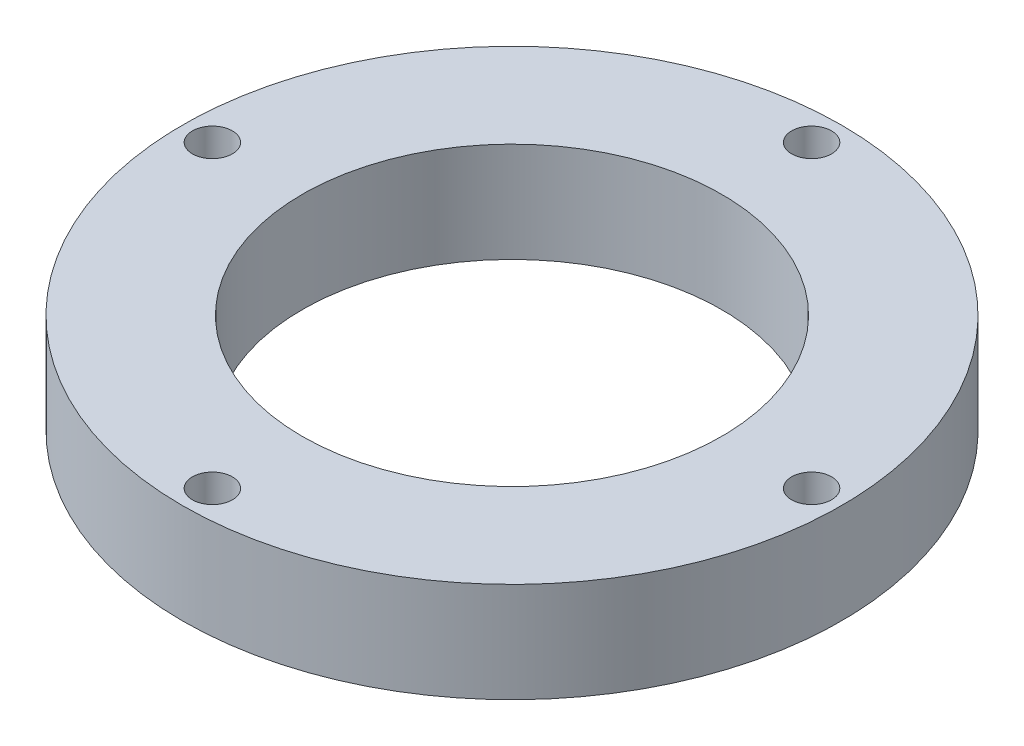
ISO-10303-21;
HEADER;
FILE_DESCRIPTION(('STEP AP214'),'2;1');
FILE_NAME('part.step','',(''),(''),'','','');
FILE_SCHEMA(('AUTOMOTIVE_DESIGN { 1 0 10303 214 1 1 1 1 }'));
ENDSEC;
DATA;
#1=APPLICATION_CONTEXT('core data for automotive mechanical design processes');
#2=APPLICATION_PROTOCOL_DEFINITION('international standard','automotive_design',2000,#1);
#3=PRODUCT_CONTEXT('',#1,'mechanical');
#4=PRODUCT('Part','Part','',(#3));
#5=PRODUCT_RELATED_PRODUCT_CATEGORY('part','',(#4));
#6=PRODUCT_DEFINITION_FORMATION('','',#4);
#7=PRODUCT_DEFINITION_CONTEXT('part definition',#1,'design');
#8=PRODUCT_DEFINITION('design','',#6,#7);
#9=PRODUCT_DEFINITION_SHAPE('','',#8);
#10=(LENGTH_UNIT() NAMED_UNIT(*) SI_UNIT(.MILLI.,.METRE.));
#11=(NAMED_UNIT(*) PLANE_ANGLE_UNIT() SI_UNIT($,.RADIAN.));
#12=(NAMED_UNIT(*) SI_UNIT($,.STERADIAN.) SOLID_ANGLE_UNIT());
#13=UNCERTAINTY_MEASURE_WITH_UNIT(LENGTH_MEASURE(1.E-05),#10,'distance_accuracy_value','');
#14=(GEOMETRIC_REPRESENTATION_CONTEXT(3) GLOBAL_UNCERTAINTY_ASSIGNED_CONTEXT((#13)) GLOBAL_UNIT_ASSIGNED_CONTEXT((#10,
#11,#12)) REPRESENTATION_CONTEXT('',''));
#15=CARTESIAN_POINT('',(0.,0.,0.));
#16=DIRECTION('',(0.,0.,1.));
#17=DIRECTION('',(1.,0.,0.));
#18=AXIS2_PLACEMENT_3D('',#15,#16,#17);
#19=CARTESIAN_POINT('',(0.,12.7,0.));
#20=DIRECTION('',(0.,-1.,0.));
#21=DIRECTION('',(0.,0.,-1.));
#22=AXIS2_PLACEMENT_3D('',#19,#20,#21);
#23=CYLINDRICAL_SURFACE('',#22,41.91);
#24=CARTESIAN_POINT('',(0.,12.7,0.));
#25=DIRECTION('',(0.,1.,0.));
#26=DIRECTION('',(0.,0.,1.));
#27=AXIS2_PLACEMENT_3D('',#24,#25,#26);
#28=CIRCLE('',#27,41.91);
#29=CARTESIAN_POINT('',(0.,12.7,41.91));
#30=VERTEX_POINT('',#29);
#31=EDGE_CURVE('E11',#30,#30,#28,.T.);
#32=ORIENTED_EDGE('',*,*,#31,.F.);
#33=EDGE_LOOP('',(#32));
#34=FACE_BOUND('',#33,.T.);
#35=CARTESIAN_POINT('',(0.,0.,0.));
#36=DIRECTION('',(0.,1.,0.));
#37=DIRECTION('',(0.,0.,1.));
#38=AXIS2_PLACEMENT_3D('',#35,#36,#37);
#39=CIRCLE('',#38,41.91);
#40=CARTESIAN_POINT('',(0.,0.,41.91));
#41=VERTEX_POINT('',#40);
#42=EDGE_CURVE('E44',#41,#41,#39,.T.);
#43=ORIENTED_EDGE('',*,*,#42,.T.);
#44=EDGE_LOOP('',(#43));
#45=FACE_BOUND('',#44,.T.);
#46=ADVANCED_FACE('F41',(#34,#45),#23,.T.);
#47=CARTESIAN_POINT('',(0.,12.7,0.));
#48=DIRECTION('',(0.,1.,0.));
#49=DIRECTION('',(0.,0.,1.));
#50=AXIS2_PLACEMENT_3D('',#47,#48,#49);
#51=PLANE('',#50);
#52=CARTESIAN_POINT('',(38.1,12.7,1.33025439009923E-13));
#53=DIRECTION('',(0.,1.,0.));
#54=DIRECTION('',(-1.,0.,0.));
#55=AXIS2_PLACEMENT_3D('',#52,#53,#54);
#56=CIRCLE('',#55,2.54);
#57=CARTESIAN_POINT('',(38.1,12.7,2.54000000000013));
#58=VERTEX_POINT('',#57);
#59=EDGE_CURVE('E75',#58,#58,#56,.T.);
#60=ORIENTED_EDGE('',*,*,#59,.F.);
#61=EDGE_LOOP('',(#60));
#62=FACE_BOUND('',#61,.T.);
#63=CARTESIAN_POINT('',(0.,12.7,38.1));
#64=DIRECTION('',(0.,1.,0.));
#65=DIRECTION('',(0.,0.,-1.));
#66=AXIS2_PLACEMENT_3D('',#63,#64,#65);
#67=CIRCLE('',#66,2.54);
#68=CARTESIAN_POINT('',(0.,12.7,40.64));
#69=VERTEX_POINT('',#68);
#70=EDGE_CURVE('E68',#69,#69,#67,.T.);
#71=ORIENTED_EDGE('',*,*,#70,.F.);
#72=EDGE_LOOP('',(#71));
#73=FACE_BOUND('',#72,.T.);
#74=CARTESIAN_POINT('',(-38.1,12.7,-3.9907631702977E-13));
#75=DIRECTION('',(0.,1.,0.));
#76=DIRECTION('',(1.,0.,0.));
#77=AXIS2_PLACEMENT_3D('',#74,#75,#76);
#78=CIRCLE('',#77,2.54);
#79=CARTESIAN_POINT('',(-38.1,12.7,2.5399999999996));
#80=VERTEX_POINT('',#79);
#81=EDGE_CURVE('E69',#80,#80,#78,.T.);
#82=ORIENTED_EDGE('',*,*,#81,.F.);
#83=EDGE_LOOP('',(#82));
#84=FACE_BOUND('',#83,.T.);
#85=CARTESIAN_POINT('',(0.,12.7,-38.1));
#86=DIRECTION('',(0.,1.,0.));
#87=DIRECTION('',(0.,0.,1.));
#88=AXIS2_PLACEMENT_3D('',#85,#86,#87);
#89=CIRCLE('',#88,2.54);
#90=CARTESIAN_POINT('',(0.,12.7,-35.56));
#91=VERTEX_POINT('',#90);
#92=EDGE_CURVE('E61',#91,#91,#89,.T.);
#93=ORIENTED_EDGE('',*,*,#92,.F.);
#94=EDGE_LOOP('',(#93));
#95=FACE_BOUND('',#94,.T.);
#96=CARTESIAN_POINT('',(0.,12.7,0.));
#97=DIRECTION('',(0.,1.,0.));
#98=DIRECTION('',(0.,0.,1.));
#99=AXIS2_PLACEMENT_3D('',#96,#97,#98);
#100=CIRCLE('',#99,26.67);
#101=CARTESIAN_POINT('',(0.,12.7,26.67));
#102=VERTEX_POINT('',#101);
#103=EDGE_CURVE('E53',#102,#102,#100,.T.);
#104=ORIENTED_EDGE('',*,*,#103,.F.);
#105=EDGE_LOOP('',(#104));
#106=FACE_BOUND('',#105,.T.);
#107=ORIENTED_EDGE('',*,*,#31,.T.);
#108=EDGE_LOOP('',(#107));
#109=FACE_BOUND('',#108,.T.);
#110=ADVANCED_FACE('F85',(#62,#73,#84,#95,#106,#109),#51,.T.);
#111=CARTESIAN_POINT('',(0.,0.,0.));
#112=DIRECTION('',(0.,1.,0.));
#113=DIRECTION('',(0.,0.,1.));
#114=AXIS2_PLACEMENT_3D('',#111,#112,#113);
#115=PLANE('',#114);
#116=CARTESIAN_POINT('',(38.1,0.,1.33025439009923E-13));
#117=DIRECTION('',(0.,1.,0.));
#118=DIRECTION('',(0.,0.,1.));
#119=AXIS2_PLACEMENT_3D('',#116,#117,#118);
#120=CIRCLE('',#119,2.54);
#121=CARTESIAN_POINT('',(38.1,0.,2.54000000000013));
#122=VERTEX_POINT('',#121);
#123=EDGE_CURVE('E64',#122,#122,#120,.F.);
#124=ORIENTED_EDGE('',*,*,#123,.F.);
#125=EDGE_LOOP('',(#124));
#126=FACE_BOUND('',#125,.T.);
#127=CARTESIAN_POINT('',(0.,0.,38.1));
#128=DIRECTION('',(0.,1.,0.));
#129=DIRECTION('',(0.,0.,1.));
#130=AXIS2_PLACEMENT_3D('',#127,#128,#129);
#131=CIRCLE('',#130,2.54);
#132=CARTESIAN_POINT('',(0.,0.,40.64));
#133=VERTEX_POINT('',#132);
#134=EDGE_CURVE('E72',#133,#133,#131,.F.);
#135=ORIENTED_EDGE('',*,*,#134,.F.);
#136=EDGE_LOOP('',(#135));
#137=FACE_BOUND('',#136,.T.);
#138=CARTESIAN_POINT('',(-38.1,0.,-3.9907631702977E-13));
#139=DIRECTION('',(0.,1.,0.));
#140=DIRECTION('',(0.,0.,1.));
#141=AXIS2_PLACEMENT_3D('',#138,#139,#140);
#142=CIRCLE('',#141,2.54);
#143=CARTESIAN_POINT('',(-38.1,0.,2.5399999999996));
#144=VERTEX_POINT('',#143);
#145=EDGE_CURVE('E65',#144,#144,#142,.F.);
#146=ORIENTED_EDGE('',*,*,#145,.F.);
#147=EDGE_LOOP('',(#146));
#148=FACE_BOUND('',#147,.T.);
#149=CARTESIAN_POINT('',(0.,0.,-38.1));
#150=DIRECTION('',(0.,1.,0.));
#151=DIRECTION('',(0.,0.,1.));
#152=AXIS2_PLACEMENT_3D('',#149,#150,#151);
#153=CIRCLE('',#152,2.54);
#154=CARTESIAN_POINT('',(0.,0.,-35.56));
#155=VERTEX_POINT('',#154);
#156=EDGE_CURVE('E56',#155,#155,#153,.F.);
#157=ORIENTED_EDGE('',*,*,#156,.F.);
#158=EDGE_LOOP('',(#157));
#159=FACE_BOUND('',#158,.T.);
#160=CARTESIAN_POINT('',(0.,0.,0.));
#161=DIRECTION('',(0.,1.,0.));
#162=DIRECTION('',(0.,0.,1.));
#163=AXIS2_PLACEMENT_3D('',#160,#161,#162);
#164=CIRCLE('',#163,26.67);
#165=CARTESIAN_POINT('',(0.,0.,26.67));
#166=VERTEX_POINT('',#165);
#167=EDGE_CURVE('E51',#166,#166,#164,.F.);
#168=ORIENTED_EDGE('',*,*,#167,.F.);
#169=EDGE_LOOP('',(#168));
#170=FACE_BOUND('',#169,.T.);
#171=ORIENTED_EDGE('',*,*,#42,.F.);
#172=EDGE_LOOP('',(#171));
#173=FACE_BOUND('',#172,.T.);
#174=ADVANCED_FACE('F88',(#126,#137,#148,#159,#170,#173),#115,.F.);
#175=CARTESIAN_POINT('',(0.,-75.4341514169809,0.));
#176=DIRECTION('',(0.,1.,0.));
#177=DIRECTION('',(0.,0.,1.));
#178=AXIS2_PLACEMENT_3D('',#175,#176,#177);
#179=CYLINDRICAL_SURFACE('',#178,26.67);
#180=ORIENTED_EDGE('',*,*,#167,.T.);
#181=EDGE_LOOP('',(#180));
#182=FACE_BOUND('',#181,.T.);
#183=ORIENTED_EDGE('',*,*,#103,.T.);
#184=EDGE_LOOP('',(#183));
#185=FACE_BOUND('',#184,.T.);
#186=ADVANCED_FACE('F98',(#182,#185),#179,.F.);
#187=CARTESIAN_POINT('',(0.,-7.18420489685533,-38.1));
#188=DIRECTION('',(0.,1.,0.));
#189=DIRECTION('',(0.,0.,1.));
#190=AXIS2_PLACEMENT_3D('',#187,#188,#189);
#191=CYLINDRICAL_SURFACE('',#190,2.54);
#192=CARTESIAN_POINT('',(0.,0.,-35.56));
#193=CARTESIAN_POINT('',(0.,0.132291666666666,-35.56));
#194=CARTESIAN_POINT('',(0.,0.264583333333332,-35.56));
#195=CARTESIAN_POINT('',(0.,0.529166666666665,-35.56));
#196=CARTESIAN_POINT('',(0.,0.661458333333331,-35.56));
#197=CARTESIAN_POINT('',(0.,0.926041666666665,-35.56));
#198=CARTESIAN_POINT('',(0.,1.05833333333333,-35.56));
#199=CARTESIAN_POINT('',(0.,1.32291666666667,-35.56));
#200=CARTESIAN_POINT('',(0.,1.45520833333333,-35.56));
#201=CARTESIAN_POINT('',(0.,1.71979166666667,-35.56));
#202=CARTESIAN_POINT('',(0.,1.85208333333333,-35.56));
#203=CARTESIAN_POINT('',(0.,2.11666666666667,-35.56));
#204=CARTESIAN_POINT('',(0.,2.24895833333333,-35.56));
#205=CARTESIAN_POINT('',(0.,2.51354166666667,-35.56));
#206=CARTESIAN_POINT('',(0.,2.64583333333333,-35.56));
#207=CARTESIAN_POINT('',(0.,2.91041666666667,-35.56));
#208=CARTESIAN_POINT('',(0.,3.04270833333333,-35.56));
#209=CARTESIAN_POINT('',(0.,3.30729166666667,-35.56));
#210=CARTESIAN_POINT('',(0.,3.43958333333333,-35.56));
#211=CARTESIAN_POINT('',(0.,3.70416666666667,-35.56));
#212=CARTESIAN_POINT('',(0.,3.83645833333333,-35.56));
#213=CARTESIAN_POINT('',(0.,4.10104166666667,-35.56));
#214=CARTESIAN_POINT('',(0.,4.23333333333333,-35.56));
#215=CARTESIAN_POINT('',(0.,4.49791666666667,-35.56));
#216=CARTESIAN_POINT('',(0.,4.63020833333333,-35.56));
#217=CARTESIAN_POINT('',(0.,4.89479166666667,-35.56));
#218=CARTESIAN_POINT('',(0.,5.02708333333333,-35.56));
#219=CARTESIAN_POINT('',(0.,5.29166666666667,-35.56));
#220=CARTESIAN_POINT('',(0.,5.42395833333333,-35.56));
#221=CARTESIAN_POINT('',(0.,5.68854166666667,-35.56));
#222=CARTESIAN_POINT('',(0.,5.82083333333333,-35.56));
#223=CARTESIAN_POINT('',(0.,6.08541666666667,-35.56));
#224=CARTESIAN_POINT('',(0.,6.21770833333333,-35.56));
#225=CARTESIAN_POINT('',(0.,6.48229166666667,-35.56));
#226=CARTESIAN_POINT('',(0.,6.61458333333333,-35.56));
#227=CARTESIAN_POINT('',(0.,6.87916666666667,-35.56));
#228=CARTESIAN_POINT('',(0.,7.01145833333333,-35.56));
#229=CARTESIAN_POINT('',(0.,7.27604166666667,-35.56));
#230=CARTESIAN_POINT('',(0.,7.40833333333333,-35.56));
#231=CARTESIAN_POINT('',(0.,7.67291666666667,-35.56));
#232=CARTESIAN_POINT('',(0.,7.80520833333333,-35.56));
#233=CARTESIAN_POINT('',(0.,8.06979166666667,-35.56));
#234=CARTESIAN_POINT('',(0.,8.20208333333333,-35.56));
#235=CARTESIAN_POINT('',(0.,8.46666666666667,-35.56));
#236=CARTESIAN_POINT('',(0.,8.59895833333333,-35.56));
#237=CARTESIAN_POINT('',(0.,8.86354166666666,-35.56));
#238=CARTESIAN_POINT('',(0.,8.99583333333333,-35.56));
#239=CARTESIAN_POINT('',(0.,9.26041666666666,-35.56));
#240=CARTESIAN_POINT('',(0.,9.39270833333333,-35.56));
#241=CARTESIAN_POINT('',(0.,9.65729166666667,-35.56));
#242=CARTESIAN_POINT('',(0.,9.78958333333333,-35.56));
#243=CARTESIAN_POINT('',(0.,10.0541666666667,-35.56));
#244=CARTESIAN_POINT('',(0.,10.1864583333333,-35.56));
#245=CARTESIAN_POINT('',(0.,10.4510416666667,-35.56));
#246=CARTESIAN_POINT('',(0.,10.5833333333333,-35.56));
#247=CARTESIAN_POINT('',(0.,10.8479166666667,-35.56));
#248=CARTESIAN_POINT('',(0.,10.9802083333333,-35.56));
#249=CARTESIAN_POINT('',(0.,11.2447916666667,-35.56));
#250=CARTESIAN_POINT('',(0.,11.3770833333333,-35.56));
#251=CARTESIAN_POINT('',(0.,11.6416666666667,-35.56));
#252=CARTESIAN_POINT('',(0.,11.7739583333333,-35.56));
#253=CARTESIAN_POINT('',(0.,12.0385416666667,-35.56));
#254=CARTESIAN_POINT('',(0.,12.1708333333333,-35.56));
#255=CARTESIAN_POINT('',(0.,12.4354166666667,-35.56));
#256=CARTESIAN_POINT('',(0.,12.5677083333333,-35.56));
#257=CARTESIAN_POINT('',(0.,12.7,-35.56));
#258=B_SPLINE_CURVE_WITH_KNOTS('',3,(#192,#193,#194,#195,#196,#197,#198,#199,#200,#201,#202,
#203,#204,#205,#206,#207,#208,#209,#210,#211,#212,#213,#214,#215,#216,#217,#218,#219,#220,#221,
#222,#223,#224,#225,#226,#227,#228,#229,#230,#231,#232,#233,#234,#235,#236,#237,#238,#239,#240,
#241,#242,#243,#244,#245,#246,#247,#248,#249,#250,#251,#252,#253,#254,#255,#256,#257),
.UNSPECIFIED.,.F.,.F.,(4,2,2,2,2,2,2,2,2,2,2,2,2,2,2,2,2,2,2,2,2,2,2,2,2,2,2,2,2,2,2,2,4),(0.,
0.396875,0.793749999999998,1.190625,1.5875,1.984375,2.38125,2.778125,3.175,3.571875,3.96875,
4.365625,4.7625,5.159375,5.55625,5.953125,6.35,6.746875,7.14375,7.540625,7.9375,8.334375,
8.73125,9.128125,9.525,9.921875,10.31875,10.715625,11.1125,11.509375,11.90625,12.303125,12.7),.UNSPECIFIED.);
#259=EDGE_CURVE('BSEAM100',#155,#91,#258,.T.);
#260=ORIENTED_EDGE('',*,*,#156,.T.);
#261=ORIENTED_EDGE('',*,*,#92,.T.);
#262=ORIENTED_EDGE('',*,*,#259,.T.);
#263=ORIENTED_EDGE('',*,*,#259,.F.);
#264=EDGE_LOOP('',(#260,#262,#261,#263));
#265=FACE_BOUND('',#264,.T.);
#266=ADVANCED_FACE('F100',(#265),#191,.F.);
#267=CARTESIAN_POINT('',(-38.1,-7.18420489685533,-3.9907631702977E-13));
#268=DIRECTION('',(0.,1.,0.));
#269=DIRECTION('',(0.,0.,1.));
#270=AXIS2_PLACEMENT_3D('',#267,#268,#269);
#271=CYLINDRICAL_SURFACE('',#270,2.54);
#272=CARTESIAN_POINT('',(-38.1,0.,2.5399999999996));
#273=CARTESIAN_POINT('',(-38.1,0.132291666666666,2.5399999999996));
#274=CARTESIAN_POINT('',(-38.1,0.264583333333332,2.5399999999996));
#275=CARTESIAN_POINT('',(-38.1,0.529166666666665,2.5399999999996));
#276=CARTESIAN_POINT('',(-38.1,0.661458333333331,2.5399999999996));
#277=CARTESIAN_POINT('',(-38.1,0.926041666666665,2.5399999999996));
#278=CARTESIAN_POINT('',(-38.1,1.05833333333333,2.5399999999996));
#279=CARTESIAN_POINT('',(-38.1,1.32291666666667,2.5399999999996));
#280=CARTESIAN_POINT('',(-38.1,1.45520833333333,2.5399999999996));
#281=CARTESIAN_POINT('',(-38.1,1.71979166666667,2.5399999999996));
#282=CARTESIAN_POINT('',(-38.1,1.85208333333333,2.5399999999996));
#283=CARTESIAN_POINT('',(-38.1,2.11666666666667,2.5399999999996));
#284=CARTESIAN_POINT('',(-38.1,2.24895833333333,2.5399999999996));
#285=CARTESIAN_POINT('',(-38.1,2.51354166666667,2.5399999999996));
#286=CARTESIAN_POINT('',(-38.1,2.64583333333333,2.5399999999996));
#287=CARTESIAN_POINT('',(-38.1,2.91041666666667,2.5399999999996));
#288=CARTESIAN_POINT('',(-38.1,3.04270833333333,2.5399999999996));
#289=CARTESIAN_POINT('',(-38.1,3.30729166666667,2.5399999999996));
#290=CARTESIAN_POINT('',(-38.1,3.43958333333333,2.5399999999996));
#291=CARTESIAN_POINT('',(-38.1,3.70416666666667,2.5399999999996));
#292=CARTESIAN_POINT('',(-38.1,3.83645833333333,2.5399999999996));
#293=CARTESIAN_POINT('',(-38.1,4.10104166666667,2.5399999999996));
#294=CARTESIAN_POINT('',(-38.1,4.23333333333333,2.5399999999996));
#295=CARTESIAN_POINT('',(-38.1,4.49791666666667,2.5399999999996));
#296=CARTESIAN_POINT('',(-38.1,4.63020833333333,2.5399999999996));
#297=CARTESIAN_POINT('',(-38.1,4.89479166666667,2.5399999999996));
#298=CARTESIAN_POINT('',(-38.1,5.02708333333333,2.5399999999996));
#299=CARTESIAN_POINT('',(-38.1,5.29166666666667,2.5399999999996));
#300=CARTESIAN_POINT('',(-38.1,5.42395833333333,2.5399999999996));
#301=CARTESIAN_POINT('',(-38.1,5.68854166666667,2.5399999999996));
#302=CARTESIAN_POINT('',(-38.1,5.82083333333333,2.5399999999996));
#303=CARTESIAN_POINT('',(-38.1,6.08541666666667,2.5399999999996));
#304=CARTESIAN_POINT('',(-38.1,6.21770833333333,2.5399999999996));
#305=CARTESIAN_POINT('',(-38.1,6.48229166666667,2.5399999999996));
#306=CARTESIAN_POINT('',(-38.1,6.61458333333333,2.5399999999996));
#307=CARTESIAN_POINT('',(-38.1,6.87916666666667,2.5399999999996));
#308=CARTESIAN_POINT('',(-38.1,7.01145833333333,2.5399999999996));
#309=CARTESIAN_POINT('',(-38.1,7.27604166666667,2.5399999999996));
#310=CARTESIAN_POINT('',(-38.1,7.40833333333333,2.5399999999996));
#311=CARTESIAN_POINT('',(-38.1,7.67291666666667,2.5399999999996));
#312=CARTESIAN_POINT('',(-38.1,7.80520833333333,2.5399999999996));
#313=CARTESIAN_POINT('',(-38.1,8.06979166666667,2.5399999999996));
#314=CARTESIAN_POINT('',(-38.1,8.20208333333333,2.5399999999996));
#315=CARTESIAN_POINT('',(-38.1,8.46666666666667,2.5399999999996));
#316=CARTESIAN_POINT('',(-38.1,8.59895833333333,2.5399999999996));
#317=CARTESIAN_POINT('',(-38.1,8.86354166666666,2.5399999999996));
#318=CARTESIAN_POINT('',(-38.1,8.99583333333333,2.5399999999996));
#319=CARTESIAN_POINT('',(-38.1,9.26041666666666,2.5399999999996));
#320=CARTESIAN_POINT('',(-38.1,9.39270833333333,2.5399999999996));
#321=CARTESIAN_POINT('',(-38.1,9.65729166666667,2.5399999999996));
#322=CARTESIAN_POINT('',(-38.1,9.78958333333333,2.5399999999996));
#323=CARTESIAN_POINT('',(-38.1,10.0541666666667,2.5399999999996));
#324=CARTESIAN_POINT('',(-38.1,10.1864583333333,2.5399999999996));
#325=CARTESIAN_POINT('',(-38.1,10.4510416666667,2.5399999999996));
#326=CARTESIAN_POINT('',(-38.1,10.5833333333333,2.5399999999996));
#327=CARTESIAN_POINT('',(-38.1,10.8479166666667,2.5399999999996));
#328=CARTESIAN_POINT('',(-38.1,10.9802083333333,2.5399999999996));
#329=CARTESIAN_POINT('',(-38.1,11.2447916666667,2.5399999999996));
#330=CARTESIAN_POINT('',(-38.1,11.3770833333333,2.5399999999996));
#331=CARTESIAN_POINT('',(-38.1,11.6416666666667,2.5399999999996));
#332=CARTESIAN_POINT('',(-38.1,11.7739583333333,2.5399999999996));
#333=CARTESIAN_POINT('',(-38.1,12.0385416666667,2.5399999999996));
#334=CARTESIAN_POINT('',(-38.1,12.1708333333333,2.5399999999996));
#335=CARTESIAN_POINT('',(-38.1,12.4354166666667,2.5399999999996));
#336=CARTESIAN_POINT('',(-38.1,12.5677083333333,2.5399999999996));
#337=CARTESIAN_POINT('',(-38.1,12.7,2.5399999999996));
#338=B_SPLINE_CURVE_WITH_KNOTS('',3,(#272,#273,#274,#275,#276,#277,#278,#279,#280,#281,#282,
#283,#284,#285,#286,#287,#288,#289,#290,#291,#292,#293,#294,#295,#296,#297,#298,#299,#300,#301,
#302,#303,#304,#305,#306,#307,#308,#309,#310,#311,#312,#313,#314,#315,#316,#317,#318,#319,#320,
#321,#322,#323,#324,#325,#326,#327,#328,#329,#330,#331,#332,#333,#334,#335,#336,#337),
.UNSPECIFIED.,.F.,.F.,(4,2,2,2,2,2,2,2,2,2,2,2,2,2,2,2,2,2,2,2,2,2,2,2,2,2,2,2,2,2,2,2,4),(0.,
0.396875,0.793749999999998,1.190625,1.5875,1.984375,2.38125,2.778125,3.175,3.571875,3.96875,
4.365625,4.7625,5.159375,5.55625,5.953125,6.35,6.746875,7.14375,7.540625,7.9375,8.334375,
8.73125,9.128125,9.525,9.921875,10.31875,10.715625,11.1125,11.509375,11.90625,12.303125,12.7),.UNSPECIFIED.);
#339=EDGE_CURVE('BSEAM107',#144,#80,#338,.T.);
#340=ORIENTED_EDGE('',*,*,#145,.T.);
#341=ORIENTED_EDGE('',*,*,#81,.T.);
#342=ORIENTED_EDGE('',*,*,#339,.T.);
#343=ORIENTED_EDGE('',*,*,#339,.F.);
#344=EDGE_LOOP('',(#340,#342,#341,#343));
#345=FACE_BOUND('',#344,.T.);
#346=ADVANCED_FACE('F107',(#345),#271,.F.);
#347=CARTESIAN_POINT('',(0.,-7.18420489685533,38.1));
#348=DIRECTION('',(0.,1.,0.));
#349=DIRECTION('',(0.,0.,1.));
#350=AXIS2_PLACEMENT_3D('',#347,#348,#349);
#351=CYLINDRICAL_SURFACE('',#350,2.54);
#352=CARTESIAN_POINT('',(0.,0.,40.64));
#353=CARTESIAN_POINT('',(0.,0.132291666666666,40.64));
#354=CARTESIAN_POINT('',(0.,0.264583333333332,40.64));
#355=CARTESIAN_POINT('',(0.,0.529166666666665,40.64));
#356=CARTESIAN_POINT('',(0.,0.661458333333331,40.64));
#357=CARTESIAN_POINT('',(0.,0.926041666666665,40.64));
#358=CARTESIAN_POINT('',(0.,1.05833333333333,40.64));
#359=CARTESIAN_POINT('',(0.,1.32291666666667,40.64));
#360=CARTESIAN_POINT('',(0.,1.45520833333333,40.64));
#361=CARTESIAN_POINT('',(0.,1.71979166666667,40.64));
#362=CARTESIAN_POINT('',(0.,1.85208333333333,40.64));
#363=CARTESIAN_POINT('',(0.,2.11666666666667,40.64));
#364=CARTESIAN_POINT('',(0.,2.24895833333333,40.64));
#365=CARTESIAN_POINT('',(0.,2.51354166666667,40.64));
#366=CARTESIAN_POINT('',(0.,2.64583333333333,40.64));
#367=CARTESIAN_POINT('',(0.,2.91041666666667,40.64));
#368=CARTESIAN_POINT('',(0.,3.04270833333333,40.64));
#369=CARTESIAN_POINT('',(0.,3.30729166666667,40.64));
#370=CARTESIAN_POINT('',(0.,3.43958333333333,40.64));
#371=CARTESIAN_POINT('',(0.,3.70416666666667,40.64));
#372=CARTESIAN_POINT('',(0.,3.83645833333333,40.64));
#373=CARTESIAN_POINT('',(0.,4.10104166666667,40.64));
#374=CARTESIAN_POINT('',(0.,4.23333333333333,40.64));
#375=CARTESIAN_POINT('',(0.,4.49791666666667,40.64));
#376=CARTESIAN_POINT('',(0.,4.63020833333333,40.64));
#377=CARTESIAN_POINT('',(0.,4.89479166666667,40.64));
#378=CARTESIAN_POINT('',(0.,5.02708333333333,40.64));
#379=CARTESIAN_POINT('',(0.,5.29166666666667,40.64));
#380=CARTESIAN_POINT('',(0.,5.42395833333333,40.64));
#381=CARTESIAN_POINT('',(0.,5.68854166666667,40.64));
#382=CARTESIAN_POINT('',(0.,5.82083333333333,40.64));
#383=CARTESIAN_POINT('',(0.,6.08541666666667,40.64));
#384=CARTESIAN_POINT('',(0.,6.21770833333333,40.64));
#385=CARTESIAN_POINT('',(0.,6.48229166666667,40.64));
#386=CARTESIAN_POINT('',(0.,6.61458333333333,40.64));
#387=CARTESIAN_POINT('',(0.,6.87916666666667,40.64));
#388=CARTESIAN_POINT('',(0.,7.01145833333333,40.64));
#389=CARTESIAN_POINT('',(0.,7.27604166666667,40.64));
#390=CARTESIAN_POINT('',(0.,7.40833333333333,40.64));
#391=CARTESIAN_POINT('',(0.,7.67291666666667,40.64));
#392=CARTESIAN_POINT('',(0.,7.80520833333333,40.64));
#393=CARTESIAN_POINT('',(0.,8.06979166666667,40.64));
#394=CARTESIAN_POINT('',(0.,8.20208333333333,40.64));
#395=CARTESIAN_POINT('',(0.,8.46666666666667,40.64));
#396=CARTESIAN_POINT('',(0.,8.59895833333333,40.64));
#397=CARTESIAN_POINT('',(0.,8.86354166666666,40.64));
#398=CARTESIAN_POINT('',(0.,8.99583333333333,40.64));
#399=CARTESIAN_POINT('',(0.,9.26041666666666,40.64));
#400=CARTESIAN_POINT('',(0.,9.39270833333333,40.64));
#401=CARTESIAN_POINT('',(0.,9.65729166666667,40.64));
#402=CARTESIAN_POINT('',(0.,9.78958333333333,40.64));
#403=CARTESIAN_POINT('',(0.,10.0541666666667,40.64));
#404=CARTESIAN_POINT('',(0.,10.1864583333333,40.64));
#405=CARTESIAN_POINT('',(0.,10.4510416666667,40.64));
#406=CARTESIAN_POINT('',(0.,10.5833333333333,40.64));
#407=CARTESIAN_POINT('',(0.,10.8479166666667,40.64));
#408=CARTESIAN_POINT('',(0.,10.9802083333333,40.64));
#409=CARTESIAN_POINT('',(0.,11.2447916666667,40.64));
#410=CARTESIAN_POINT('',(0.,11.3770833333333,40.64));
#411=CARTESIAN_POINT('',(0.,11.6416666666667,40.64));
#412=CARTESIAN_POINT('',(0.,11.7739583333333,40.64));
#413=CARTESIAN_POINT('',(0.,12.0385416666667,40.64));
#414=CARTESIAN_POINT('',(0.,12.1708333333333,40.64));
#415=CARTESIAN_POINT('',(0.,12.4354166666667,40.64));
#416=CARTESIAN_POINT('',(0.,12.5677083333333,40.64));
#417=CARTESIAN_POINT('',(0.,12.7,40.64));
#418=B_SPLINE_CURVE_WITH_KNOTS('',3,(#352,#353,#354,#355,#356,#357,#358,#359,#360,#361,#362,
#363,#364,#365,#366,#367,#368,#369,#370,#371,#372,#373,#374,#375,#376,#377,#378,#379,#380,#381,
#382,#383,#384,#385,#386,#387,#388,#389,#390,#391,#392,#393,#394,#395,#396,#397,#398,#399,#400,
#401,#402,#403,#404,#405,#406,#407,#408,#409,#410,#411,#412,#413,#414,#415,#416,#417),
.UNSPECIFIED.,.F.,.F.,(4,2,2,2,2,2,2,2,2,2,2,2,2,2,2,2,2,2,2,2,2,2,2,2,2,2,2,2,2,2,2,2,4),(0.,
0.396875,0.793749999999998,1.190625,1.5875,1.984375,2.38125,2.778125,3.175,3.571875,3.96875,
4.365625,4.7625,5.159375,5.55625,5.953125,6.35,6.746875,7.14375,7.540625,7.9375,8.334375,
8.73125,9.128125,9.525,9.921875,10.31875,10.715625,11.1125,11.509375,11.90625,12.303125,12.7),.UNSPECIFIED.);
#419=EDGE_CURVE('BSEAM145',#133,#69,#418,.T.);
#420=ORIENTED_EDGE('',*,*,#134,.T.);
#421=ORIENTED_EDGE('',*,*,#70,.T.);
#422=ORIENTED_EDGE('',*,*,#419,.T.);
#423=ORIENTED_EDGE('',*,*,#419,.F.);
#424=EDGE_LOOP('',(#420,#422,#421,#423));
#425=FACE_BOUND('',#424,.T.);
#426=ADVANCED_FACE('F145',(#425),#351,.F.);
#427=CARTESIAN_POINT('',(38.1,-7.18420489685533,1.33025439009923E-13));
#428=DIRECTION('',(0.,1.,0.));
#429=DIRECTION('',(0.,0.,1.));
#430=AXIS2_PLACEMENT_3D('',#427,#428,#429);
#431=CYLINDRICAL_SURFACE('',#430,2.54);
#432=CARTESIAN_POINT('',(38.1,0.,2.54000000000013));
#433=CARTESIAN_POINT('',(38.1,0.132291666666666,2.54000000000013));
#434=CARTESIAN_POINT('',(38.1,0.264583333333332,2.54000000000013));
#435=CARTESIAN_POINT('',(38.1,0.529166666666665,2.54000000000013));
#436=CARTESIAN_POINT('',(38.1,0.661458333333331,2.54000000000013));
#437=CARTESIAN_POINT('',(38.1,0.926041666666665,2.54000000000013));
#438=CARTESIAN_POINT('',(38.1,1.05833333333333,2.54000000000013));
#439=CARTESIAN_POINT('',(38.1,1.32291666666667,2.54000000000013));
#440=CARTESIAN_POINT('',(38.1,1.45520833333333,2.54000000000013));
#441=CARTESIAN_POINT('',(38.1,1.71979166666667,2.54000000000013));
#442=CARTESIAN_POINT('',(38.1,1.85208333333333,2.54000000000013));
#443=CARTESIAN_POINT('',(38.1,2.11666666666667,2.54000000000013));
#444=CARTESIAN_POINT('',(38.1,2.24895833333333,2.54000000000013));
#445=CARTESIAN_POINT('',(38.1,2.51354166666667,2.54000000000013));
#446=CARTESIAN_POINT('',(38.1,2.64583333333333,2.54000000000013));
#447=CARTESIAN_POINT('',(38.1,2.91041666666667,2.54000000000013));
#448=CARTESIAN_POINT('',(38.1,3.04270833333333,2.54000000000013));
#449=CARTESIAN_POINT('',(38.1,3.30729166666667,2.54000000000013));
#450=CARTESIAN_POINT('',(38.1,3.43958333333333,2.54000000000013));
#451=CARTESIAN_POINT('',(38.1,3.70416666666667,2.54000000000013));
#452=CARTESIAN_POINT('',(38.1,3.83645833333333,2.54000000000013));
#453=CARTESIAN_POINT('',(38.1,4.10104166666667,2.54000000000013));
#454=CARTESIAN_POINT('',(38.1,4.23333333333333,2.54000000000013));
#455=CARTESIAN_POINT('',(38.1,4.49791666666667,2.54000000000013));
#456=CARTESIAN_POINT('',(38.1,4.63020833333333,2.54000000000013));
#457=CARTESIAN_POINT('',(38.1,4.89479166666667,2.54000000000013));
#458=CARTESIAN_POINT('',(38.1,5.02708333333333,2.54000000000013));
#459=CARTESIAN_POINT('',(38.1,5.29166666666667,2.54000000000013));
#460=CARTESIAN_POINT('',(38.1,5.42395833333333,2.54000000000013));
#461=CARTESIAN_POINT('',(38.1,5.68854166666667,2.54000000000013));
#462=CARTESIAN_POINT('',(38.1,5.82083333333333,2.54000000000013));
#463=CARTESIAN_POINT('',(38.1,6.08541666666667,2.54000000000013));
#464=CARTESIAN_POINT('',(38.1,6.21770833333333,2.54000000000013));
#465=CARTESIAN_POINT('',(38.1,6.48229166666667,2.54000000000013));
#466=CARTESIAN_POINT('',(38.1,6.61458333333333,2.54000000000013));
#467=CARTESIAN_POINT('',(38.1,6.87916666666667,2.54000000000013));
#468=CARTESIAN_POINT('',(38.1,7.01145833333333,2.54000000000013));
#469=CARTESIAN_POINT('',(38.1,7.27604166666667,2.54000000000013));
#470=CARTESIAN_POINT('',(38.1,7.40833333333333,2.54000000000013));
#471=CARTESIAN_POINT('',(38.1,7.67291666666667,2.54000000000013));
#472=CARTESIAN_POINT('',(38.1,7.80520833333333,2.54000000000013));
#473=CARTESIAN_POINT('',(38.1,8.06979166666667,2.54000000000013));
#474=CARTESIAN_POINT('',(38.1,8.20208333333333,2.54000000000013));
#475=CARTESIAN_POINT('',(38.1,8.46666666666667,2.54000000000013));
#476=CARTESIAN_POINT('',(38.1,8.59895833333333,2.54000000000013));
#477=CARTESIAN_POINT('',(38.1,8.86354166666666,2.54000000000013));
#478=CARTESIAN_POINT('',(38.1,8.99583333333333,2.54000000000013));
#479=CARTESIAN_POINT('',(38.1,9.26041666666666,2.54000000000013));
#480=CARTESIAN_POINT('',(38.1,9.39270833333333,2.54000000000013));
#481=CARTESIAN_POINT('',(38.1,9.65729166666667,2.54000000000013));
#482=CARTESIAN_POINT('',(38.1,9.78958333333333,2.54000000000013));
#483=CARTESIAN_POINT('',(38.1,10.0541666666667,2.54000000000013));
#484=CARTESIAN_POINT('',(38.1,10.1864583333333,2.54000000000013));
#485=CARTESIAN_POINT('',(38.1,10.4510416666667,2.54000000000013));
#486=CARTESIAN_POINT('',(38.1,10.5833333333333,2.54000000000013));
#487=CARTESIAN_POINT('',(38.1,10.8479166666667,2.54000000000013));
#488=CARTESIAN_POINT('',(38.1,10.9802083333333,2.54000000000013));
#489=CARTESIAN_POINT('',(38.1,11.2447916666667,2.54000000000013));
#490=CARTESIAN_POINT('',(38.1,11.3770833333333,2.54000000000013));
#491=CARTESIAN_POINT('',(38.1,11.6416666666667,2.54000000000013));
#492=CARTESIAN_POINT('',(38.1,11.7739583333333,2.54000000000013));
#493=CARTESIAN_POINT('',(38.1,12.0385416666667,2.54000000000013));
#494=CARTESIAN_POINT('',(38.1,12.1708333333333,2.54000000000013));
#495=CARTESIAN_POINT('',(38.1,12.4354166666667,2.54000000000013));
#496=CARTESIAN_POINT('',(38.1,12.5677083333333,2.54000000000013));
#497=CARTESIAN_POINT('',(38.1,12.7,2.54000000000013));
#498=B_SPLINE_CURVE_WITH_KNOTS('',3,(#432,#433,#434,#435,#436,#437,#438,#439,#440,#441,#442,
#443,#444,#445,#446,#447,#448,#449,#450,#451,#452,#453,#454,#455,#456,#457,#458,#459,#460,#461,
#462,#463,#464,#465,#466,#467,#468,#469,#470,#471,#472,#473,#474,#475,#476,#477,#478,#479,#480,
#481,#482,#483,#484,#485,#486,#487,#488,#489,#490,#491,#492,#493,#494,#495,#496,#497),
.UNSPECIFIED.,.F.,.F.,(4,2,2,2,2,2,2,2,2,2,2,2,2,2,2,2,2,2,2,2,2,2,2,2,2,2,2,2,2,2,2,2,4),(0.,
0.396875,0.793749999999998,1.190625,1.5875,1.984375,2.38125,2.778125,3.175,3.571875,3.96875,
4.365625,4.7625,5.159375,5.55625,5.953125,6.35,6.746875,7.14375,7.540625,7.9375,8.334375,
8.73125,9.128125,9.525,9.921875,10.31875,10.715625,11.1125,11.509375,11.90625,12.303125,12.7),.UNSPECIFIED.);
#499=EDGE_CURVE('BSEAM83',#122,#58,#498,.T.);
#500=ORIENTED_EDGE('',*,*,#123,.T.);
#501=ORIENTED_EDGE('',*,*,#59,.T.);
#502=ORIENTED_EDGE('',*,*,#499,.T.);
#503=ORIENTED_EDGE('',*,*,#499,.F.);
#504=EDGE_LOOP('',(#500,#502,#501,#503));
#505=FACE_BOUND('',#504,.T.);
#506=ADVANCED_FACE('F83',(#505),#431,.F.);
#507=CLOSED_SHELL('',(#46,#110,#174,#186,#266,#346,#426,#506));
#508=MANIFOLD_SOLID_BREP('B2',#507);
#509=ADVANCED_BREP_SHAPE_REPRESENTATION('',(#18,#508),#14);
#510=SHAPE_DEFINITION_REPRESENTATION(#9,#509);
ENDSEC;
END-ISO-10303-21;
